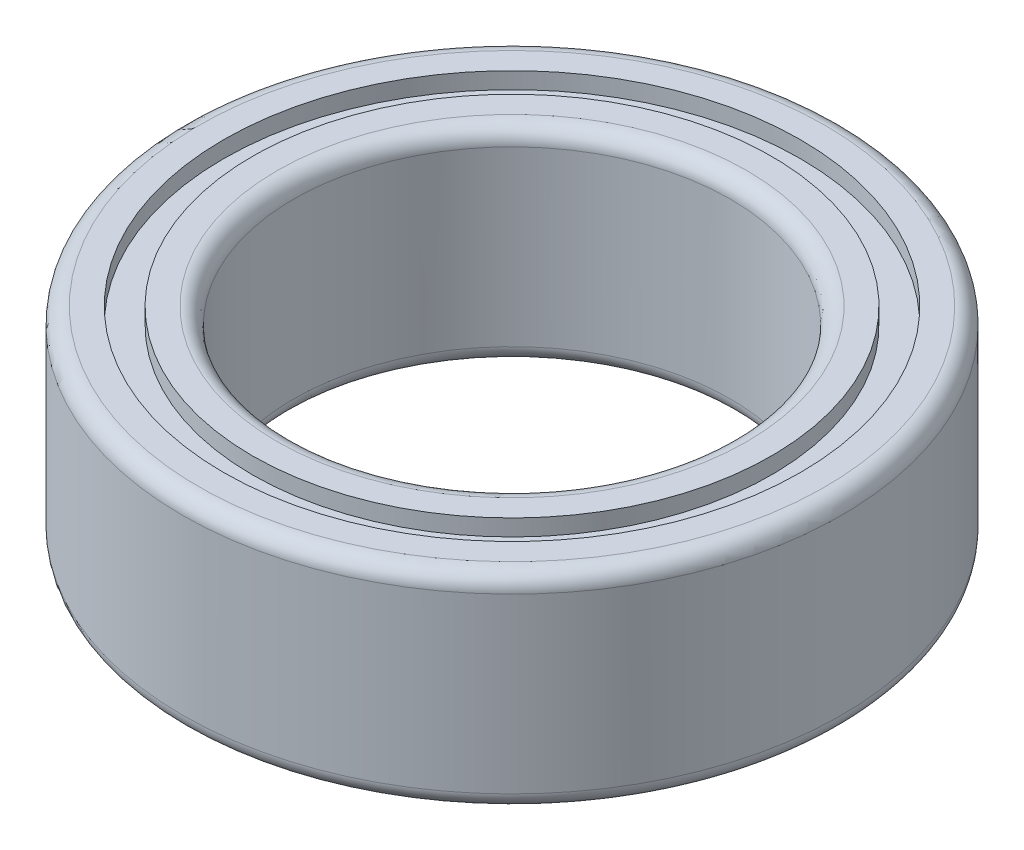
ISO-10303-21;
HEADER;
FILE_DESCRIPTION(('STEP AP214'),'2;1');
FILE_NAME('part.step','',(''),(''),'','','');
FILE_SCHEMA(('AUTOMOTIVE_DESIGN { 1 0 10303 214 1 1 1 1 }'));
ENDSEC;
DATA;
#1=APPLICATION_CONTEXT('core data for automotive mechanical design processes');
#2=APPLICATION_PROTOCOL_DEFINITION('international standard','automotive_design',2000,#1);
#3=PRODUCT_CONTEXT('',#1,'mechanical');
#4=PRODUCT('Part','Part','',(#3));
#5=PRODUCT_RELATED_PRODUCT_CATEGORY('part','',(#4));
#6=PRODUCT_DEFINITION_FORMATION('','',#4);
#7=PRODUCT_DEFINITION_CONTEXT('part definition',#1,'design');
#8=PRODUCT_DEFINITION('design','',#6,#7);
#9=PRODUCT_DEFINITION_SHAPE('','',#8);
#10=(LENGTH_UNIT() NAMED_UNIT(*) SI_UNIT(.MILLI.,.METRE.));
#11=(NAMED_UNIT(*) PLANE_ANGLE_UNIT() SI_UNIT($,.RADIAN.));
#12=(NAMED_UNIT(*) SI_UNIT($,.STERADIAN.) SOLID_ANGLE_UNIT());
#13=UNCERTAINTY_MEASURE_WITH_UNIT(LENGTH_MEASURE(1.E-05),#10,'distance_accuracy_value','');
#14=(GEOMETRIC_REPRESENTATION_CONTEXT(3) GLOBAL_UNCERTAINTY_ASSIGNED_CONTEXT((#13)) GLOBAL_UNIT_ASSIGNED_CONTEXT((#10,
#11,#12)) REPRESENTATION_CONTEXT('',''));
#15=CARTESIAN_POINT('',(0.,0.,0.));
#16=DIRECTION('',(0.,0.,1.));
#17=DIRECTION('',(1.,0.,0.));
#18=AXIS2_PLACEMENT_3D('',#15,#16,#17);
#19=CARTESIAN_POINT('',(0.,1.25,-3.15));
#20=DIRECTION('',(0.,-1.,0.));
#21=DIRECTION('',(0.,0.,-1.));
#22=AXIS2_PLACEMENT_3D('',#19,#20,#21);
#23=PLANE('',#22);
#24=CARTESIAN_POINT('',(0.,1.25,0.));
#25=DIRECTION('',(0.,-1.,0.));
#26=DIRECTION('',(0.,0.,-1.));
#27=AXIS2_PLACEMENT_3D('',#24,#25,#26);
#28=CIRCLE('',#27,2.85);
#29=CARTESIAN_POINT('',(0.,1.25,-2.85));
#30=VERTEX_POINT('',#29);
#31=EDGE_CURVE('E54',#30,#30,#28,.T.);
#32=ORIENTED_EDGE('',*,*,#31,.T.);
#33=EDGE_LOOP('',(#32));
#34=FACE_BOUND('',#33,.T.);
#35=CARTESIAN_POINT('',(0.,1.25,0.));
#36=DIRECTION('',(0.,1.,0.));
#37=DIRECTION('',(0.,0.,1.));
#38=AXIS2_PLACEMENT_3D('',#35,#36,#37);
#39=CIRCLE('',#38,3.15);
#40=CARTESIAN_POINT('',(0.,1.25,3.15));
#41=VERTEX_POINT('',#40);
#42=EDGE_CURVE('E72',#41,#41,#39,.T.);
#43=ORIENTED_EDGE('',*,*,#42,.T.);
#44=EDGE_LOOP('',(#43));
#45=FACE_BOUND('',#44,.T.);
#46=ADVANCED_FACE('F31',(#34,#45),#23,.F.);
#47=CARTESIAN_POINT('',(0.,1.19367588932806,0.));
#48=DIRECTION('',(0.,1.,0.));
#49=DIRECTION('',(0.,0.,1.));
#50=AXIS2_PLACEMENT_3D('',#47,#48,#49);
#51=CYLINDRICAL_SURFACE('',#50,2.65);
#52=CARTESIAN_POINT('',(0.,1.05,0.));
#53=DIRECTION('',(0.,-1.,0.));
#54=DIRECTION('',(0.,0.,-1.));
#55=AXIS2_PLACEMENT_3D('',#52,#53,#54);
#56=CIRCLE('',#55,2.65);
#57=CARTESIAN_POINT('',(0.,1.05,-2.65));
#58=VERTEX_POINT('',#57);
#59=EDGE_CURVE('E57',#58,#58,#56,.F.);
#60=ORIENTED_EDGE('',*,*,#59,.T.);
#61=EDGE_LOOP('',(#60));
#62=FACE_BOUND('',#61,.T.);
#63=CARTESIAN_POINT('',(0.,-1.05,0.));
#64=DIRECTION('',(0.,1.,0.));
#65=DIRECTION('',(0.,0.,1.));
#66=AXIS2_PLACEMENT_3D('',#63,#64,#65);
#67=CIRCLE('',#66,2.65);
#68=CARTESIAN_POINT('',(0.,-1.05,2.65));
#69=VERTEX_POINT('',#68);
#70=EDGE_CURVE('E60',#69,#69,#67,.F.);
#71=ORIENTED_EDGE('',*,*,#70,.T.);
#72=EDGE_LOOP('',(#71));
#73=FACE_BOUND('',#72,.T.);
#74=ADVANCED_FACE('F107',(#62,#73),#51,.F.);
#75=CARTESIAN_POINT('',(0.,-1.25,-3.5));
#76=DIRECTION('',(0.,1.,0.));
#77=DIRECTION('',(0.,0.,1.));
#78=AXIS2_PLACEMENT_3D('',#75,#76,#77);
#79=PLANE('',#78);
#80=CARTESIAN_POINT('',(0.,-1.25,0.));
#81=DIRECTION('',(0.,1.,0.));
#82=DIRECTION('',(0.,0.,1.));
#83=AXIS2_PLACEMENT_3D('',#80,#81,#82);
#84=CIRCLE('',#83,3.8);
#85=CARTESIAN_POINT('',(0.,-1.25,3.8));
#86=VERTEX_POINT('',#85);
#87=EDGE_CURVE('E38',#86,#86,#84,.F.);
#88=ORIENTED_EDGE('',*,*,#87,.T.);
#89=EDGE_LOOP('',(#88));
#90=FACE_BOUND('',#89,.T.);
#91=CARTESIAN_POINT('',(0.,-1.25,0.));
#92=DIRECTION('',(0.,1.,0.));
#93=DIRECTION('',(0.,0.,1.));
#94=AXIS2_PLACEMENT_3D('',#91,#92,#93);
#95=CIRCLE('',#94,2.85);
#96=CARTESIAN_POINT('',(0.,-1.25,2.85));
#97=VERTEX_POINT('',#96);
#98=EDGE_CURVE('E51',#97,#97,#95,.T.);
#99=ORIENTED_EDGE('',*,*,#98,.T.);
#100=EDGE_LOOP('',(#99));
#101=FACE_BOUND('',#100,.T.);
#102=ADVANCED_FACE('F103',(#90,#101),#79,.F.);
#103=CARTESIAN_POINT('',(0.,1.19367588932806,0.));
#104=DIRECTION('',(0.,1.,0.));
#105=DIRECTION('',(0.,0.,1.));
#106=AXIS2_PLACEMENT_3D('',#103,#104,#105);
#107=CYLINDRICAL_SURFACE('',#106,4.);
#108=CARTESIAN_POINT('',(0.,-1.05,0.));
#109=DIRECTION('',(0.,1.,0.));
#110=DIRECTION('',(0.,0.,1.));
#111=AXIS2_PLACEMENT_3D('',#108,#109,#110);
#112=CIRCLE('',#111,4.);
#113=CARTESIAN_POINT('',(0.,-1.05,4.));
#114=VERTEX_POINT('',#113);
#115=EDGE_CURVE('E42',#114,#114,#112,.T.);
#116=ORIENTED_EDGE('',*,*,#115,.T.);
#117=EDGE_LOOP('',(#116));
#118=FACE_BOUND('',#117,.T.);
#119=CARTESIAN_POINT('',(0.,1.05,0.));
#120=DIRECTION('',(0.,-1.,0.));
#121=DIRECTION('',(0.,0.,-1.));
#122=AXIS2_PLACEMENT_3D('',#119,#120,#121);
#123=CIRCLE('',#122,4.);
#124=CARTESIAN_POINT('',(0.,1.05,-4.));
#125=VERTEX_POINT('',#124);
#126=EDGE_CURVE('E46',#125,#125,#123,.T.);
#127=ORIENTED_EDGE('',*,*,#126,.T.);
#128=EDGE_LOOP('',(#127));
#129=FACE_BOUND('',#128,.T.);
#130=ADVANCED_FACE('F98',(#118,#129),#107,.T.);
#131=CARTESIAN_POINT('',(0.,1.25,-4.));
#132=DIRECTION('',(0.,-1.,0.));
#133=DIRECTION('',(0.,0.,-1.));
#134=AXIS2_PLACEMENT_3D('',#131,#132,#133);
#135=PLANE('',#134);
#136=CARTESIAN_POINT('',(0.,1.25,0.));
#137=DIRECTION('',(0.,-1.,0.));
#138=DIRECTION('',(0.,0.,-1.));
#139=AXIS2_PLACEMENT_3D('',#136,#137,#138);
#140=CIRCLE('',#139,3.8);
#141=CARTESIAN_POINT('',(0.,1.25,-3.8));
#142=VERTEX_POINT('',#141);
#143=EDGE_CURVE('E10',#142,#142,#140,.F.);
#144=ORIENTED_EDGE('',*,*,#143,.T.);
#145=EDGE_LOOP('',(#144));
#146=FACE_BOUND('',#145,.T.);
#147=CARTESIAN_POINT('',(0.,1.25,0.));
#148=DIRECTION('',(0.,1.,0.));
#149=DIRECTION('',(0.,0.,1.));
#150=AXIS2_PLACEMENT_3D('',#147,#148,#149);
#151=CIRCLE('',#150,3.5);
#152=CARTESIAN_POINT('',(0.,1.25,3.5));
#153=VERTEX_POINT('',#152);
#154=EDGE_CURVE('E63',#153,#153,#151,.T.);
#155=ORIENTED_EDGE('',*,*,#154,.F.);
#156=EDGE_LOOP('',(#155));
#157=FACE_BOUND('',#156,.T.);
#158=ADVANCED_FACE('F93',(#146,#157),#135,.F.);
#159=CARTESIAN_POINT('',(0.,1.19367588932806,0.));
#160=DIRECTION('',(0.,1.,0.));
#161=DIRECTION('',(0.,0.,1.));
#162=AXIS2_PLACEMENT_3D('',#159,#160,#161);
#163=CYLINDRICAL_SURFACE('',#162,3.5);
#164=CARTESIAN_POINT('',(0.,1.05,0.));
#165=DIRECTION('',(0.,1.,0.));
#166=DIRECTION('',(0.,0.,1.));
#167=AXIS2_PLACEMENT_3D('',#164,#165,#166);
#168=CIRCLE('',#167,3.5);
#169=CARTESIAN_POINT('',(0.,1.05,3.5));
#170=VERTEX_POINT('',#169);
#171=EDGE_CURVE('E66',#170,#170,#168,.T.);
#172=ORIENTED_EDGE('',*,*,#171,.F.);
#173=EDGE_LOOP('',(#172));
#174=FACE_BOUND('',#173,.T.);
#175=ORIENTED_EDGE('',*,*,#154,.T.);
#176=EDGE_LOOP('',(#175));
#177=FACE_BOUND('',#176,.T.);
#178=ADVANCED_FACE('F87',(#174,#177),#163,.F.);
#179=CARTESIAN_POINT('',(0.,1.05,-3.5));
#180=DIRECTION('',(0.,-1.,0.));
#181=DIRECTION('',(0.,0.,-1.));
#182=AXIS2_PLACEMENT_3D('',#179,#180,#181);
#183=PLANE('',#182);
#184=CARTESIAN_POINT('',(0.,1.05,0.));
#185=DIRECTION('',(0.,1.,0.));
#186=DIRECTION('',(0.,0.,1.));
#187=AXIS2_PLACEMENT_3D('',#184,#185,#186);
#188=CIRCLE('',#187,3.15);
#189=CARTESIAN_POINT('',(0.,1.05,3.15));
#190=VERTEX_POINT('',#189);
#191=EDGE_CURVE('E69',#190,#190,#188,.T.);
#192=ORIENTED_EDGE('',*,*,#191,.F.);
#193=EDGE_LOOP('',(#192));
#194=FACE_BOUND('',#193,.T.);
#195=ORIENTED_EDGE('',*,*,#171,.T.);
#196=EDGE_LOOP('',(#195));
#197=FACE_BOUND('',#196,.T.);
#198=ADVANCED_FACE('F81',(#194,#197),#183,.F.);
#199=CARTESIAN_POINT('',(0.,1.19367588932806,0.));
#200=DIRECTION('',(0.,1.,0.));
#201=DIRECTION('',(0.,0.,1.));
#202=AXIS2_PLACEMENT_3D('',#199,#200,#201);
#203=CYLINDRICAL_SURFACE('',#202,3.15);
#204=ORIENTED_EDGE('',*,*,#42,.F.);
#205=EDGE_LOOP('',(#204));
#206=FACE_BOUND('',#205,.T.);
#207=ORIENTED_EDGE('',*,*,#191,.T.);
#208=EDGE_LOOP('',(#207));
#209=FACE_BOUND('',#208,.T.);
#210=ADVANCED_FACE('F77',(#206,#209),#203,.T.);
#211=CARTESIAN_POINT('',(0.,1.05,0.));
#212=DIRECTION('',(0.,-1.,0.));
#213=DIRECTION('',(0.,0.,-1.));
#214=AXIS2_PLACEMENT_3D('',#211,#212,#213);
#215=TOROIDAL_SURFACE('',#214,2.85,0.2);
#216=ORIENTED_EDGE('',*,*,#31,.F.);
#217=EDGE_LOOP('',(#216));
#218=FACE_BOUND('',#217,.T.);
#219=ORIENTED_EDGE('',*,*,#59,.F.);
#220=EDGE_LOOP('',(#219));
#221=FACE_BOUND('',#220,.T.);
#222=ADVANCED_FACE('F80',(#218,#221),#215,.T.);
#223=CARTESIAN_POINT('',(0.,-1.05,0.));
#224=DIRECTION('',(0.,1.,0.));
#225=DIRECTION('',(0.,0.,1.));
#226=AXIS2_PLACEMENT_3D('',#223,#224,#225);
#227=TOROIDAL_SURFACE('',#226,2.85,0.2);
#228=ORIENTED_EDGE('',*,*,#70,.F.);
#229=EDGE_LOOP('',(#228));
#230=FACE_BOUND('',#229,.T.);
#231=ORIENTED_EDGE('',*,*,#98,.F.);
#232=EDGE_LOOP('',(#231));
#233=FACE_BOUND('',#232,.T.);
#234=ADVANCED_FACE('F119',(#230,#233),#227,.T.);
#235=CARTESIAN_POINT('',(0.,-1.05,0.));
#236=DIRECTION('',(0.,1.,0.));
#237=DIRECTION('',(0.,0.,1.));
#238=AXIS2_PLACEMENT_3D('',#235,#236,#237);
#239=TOROIDAL_SURFACE('',#238,3.8,0.2);
#240=ORIENTED_EDGE('',*,*,#87,.F.);
#241=EDGE_LOOP('',(#240));
#242=FACE_BOUND('',#241,.T.);
#243=ORIENTED_EDGE('',*,*,#115,.F.);
#244=EDGE_LOOP('',(#243));
#245=FACE_BOUND('',#244,.T.);
#246=ADVANCED_FACE('F122',(#242,#245),#239,.T.);
#247=CARTESIAN_POINT('',(0.,1.05,0.));
#248=DIRECTION('',(0.,-1.,0.));
#249=DIRECTION('',(0.,0.,-1.));
#250=AXIS2_PLACEMENT_3D('',#247,#248,#249);
#251=TOROIDAL_SURFACE('',#250,3.8,0.2);
#252=ORIENTED_EDGE('',*,*,#126,.F.);
#253=EDGE_LOOP('',(#252));
#254=FACE_BOUND('',#253,.T.);
#255=ORIENTED_EDGE('',*,*,#143,.F.);
#256=EDGE_LOOP('',(#255));
#257=FACE_BOUND('',#256,.T.);
#258=ADVANCED_FACE('F33',(#254,#257),#251,.T.);
#259=CLOSED_SHELL('',(#46,#74,#102,#130,#158,#178,#198,#210,#222,#234,#246,#258));
#260=MANIFOLD_SOLID_BREP('B2',#259);
#261=ADVANCED_BREP_SHAPE_REPRESENTATION('',(#18,#260),#14);
#262=SHAPE_DEFINITION_REPRESENTATION(#9,#261);
ENDSEC;
END-ISO-10303-21;
